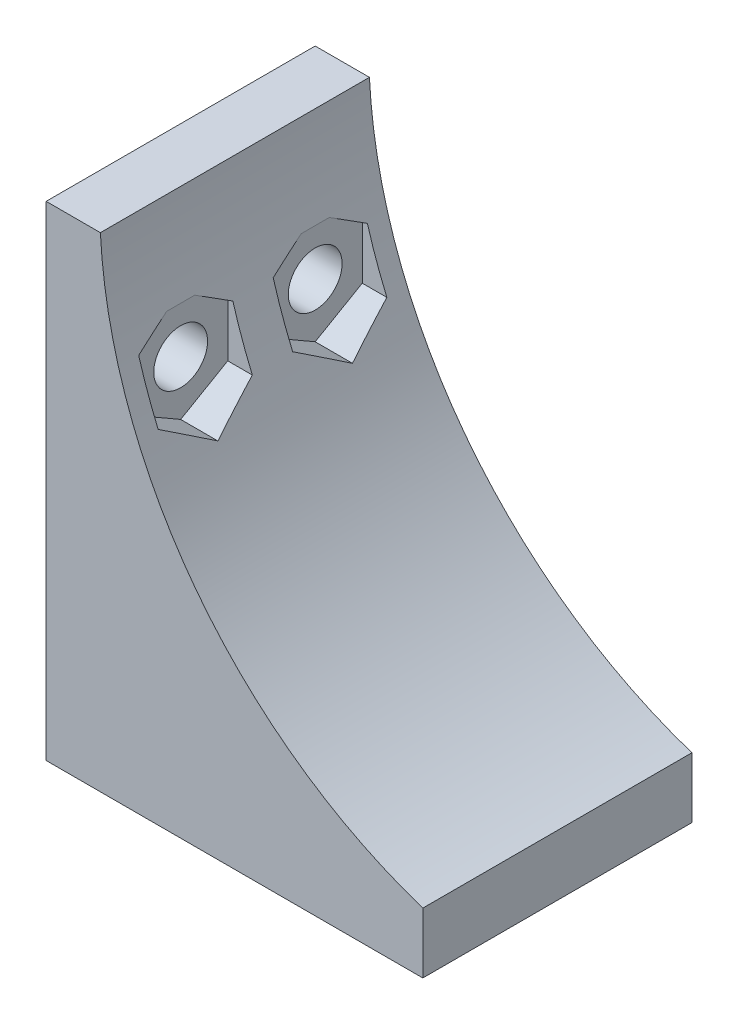
ISO-10303-21;
HEADER;
FILE_DESCRIPTION(('STEP AP214'),'2;1');
FILE_NAME('part.step','',(''),(''),'','','');
FILE_SCHEMA(('AUTOMOTIVE_DESIGN { 1 0 10303 214 1 1 1 1 }'));
ENDSEC;
DATA;
#1=APPLICATION_CONTEXT('core data for automotive mechanical design processes');
#2=APPLICATION_PROTOCOL_DEFINITION('international standard','automotive_design',2000,#1);
#3=PRODUCT_CONTEXT('',#1,'mechanical');
#4=PRODUCT('Part','Part','',(#3));
#5=PRODUCT_RELATED_PRODUCT_CATEGORY('part','',(#4));
#6=PRODUCT_DEFINITION_FORMATION('','',#4);
#7=PRODUCT_DEFINITION_CONTEXT('part definition',#1,'design');
#8=PRODUCT_DEFINITION('design','',#6,#7);
#9=PRODUCT_DEFINITION_SHAPE('','',#8);
#10=(LENGTH_UNIT() NAMED_UNIT(*) SI_UNIT(.MILLI.,.METRE.));
#11=(NAMED_UNIT(*) PLANE_ANGLE_UNIT() SI_UNIT($,.RADIAN.));
#12=(NAMED_UNIT(*) SI_UNIT($,.STERADIAN.) SOLID_ANGLE_UNIT());
#13=UNCERTAINTY_MEASURE_WITH_UNIT(LENGTH_MEASURE(1.E-05),#10,'distance_accuracy_value','');
#14=(GEOMETRIC_REPRESENTATION_CONTEXT(3) GLOBAL_UNCERTAINTY_ASSIGNED_CONTEXT((#13)) GLOBAL_UNIT_ASSIGNED_CONTEXT((#10,
#11,#12)) REPRESENTATION_CONTEXT('',''));
#15=CARTESIAN_POINT('',(0.,0.,0.));
#16=DIRECTION('',(0.,0.,1.));
#17=DIRECTION('',(1.,0.,0.));
#18=AXIS2_PLACEMENT_3D('',#15,#16,#17);
#19=CARTESIAN_POINT('',(39.1083800287427,37.8203087905264,10.));
#20=DIRECTION('',(0.,0.,-1.));
#21=DIRECTION('',(-1.,0.,0.));
#22=AXIS2_PLACEMENT_3D('',#19,#20,#21);
#23=CYLINDRICAL_SURFACE('',#22,35.1231986692414);
#24=CARTESIAN_POINT('',(39.1083800287427,37.8203087905264,-1.5));
#25=DIRECTION('',(0.,0.,-1.));
#26=DIRECTION('',(0.,1.,0.));
#27=AXIS2_PLACEMENT_3D('',#24,#25,#26);
#28=CIRCLE('',#27,35.1231986692414);
#29=CARTESIAN_POINT('',(5.37994601888869,28.0207259421637,-1.5));
#30=VERTEX_POINT('',#29);
#31=CARTESIAN_POINT('',(6.8273508895181,23.9792740578363,-1.5));
#32=VERTEX_POINT('',#31);
#33=EDGE_CURVE('E332',#30,#32,#28,.F.);
#34=ORIENTED_EDGE('',*,*,#33,.F.);
#35=CARTESIAN_POINT('',(39.1083800287427,37.8203087905264,-18.4733753863447));
#36=DIRECTION('',(0.,-0.866025403784438,-0.5));
#37=DIRECTION('',(0.,0.5,-0.866025403784438));
#38=AXIS2_PLACEMENT_3D('',#35,#36,#37);
#39=ELLIPSE('',#38,70.2463973384827,35.1231986692414);
#40=CARTESIAN_POINT('',(5.,29.4383342872326,-3.955369678893));
#41=VERTEX_POINT('',#40);
#42=EDGE_CURVE('E311',#41,#30,#39,.F.);
#43=ORIENTED_EDGE('',*,*,#42,.F.);
#44=DIRECTION('',(0.,0.,-1.));
#45=VECTOR('',#44,1.);
#46=CARTESIAN_POINT('',(5.,29.4383342872326,10.));
#47=LINE('',#46,#45);
#48=CARTESIAN_POINT('',(5.,29.4383342872326,-6.04463032110699));
#49=VERTEX_POINT('',#48);
#50=EDGE_CURVE('E248',#49,#41,#47,.F.);
#51=ORIENTED_EDGE('',*,*,#50,.F.);
#52=CARTESIAN_POINT('',(39.1083800287427,37.8203087905264,8.47337538634474));
#53=DIRECTION('',(0.,-0.866025403784438,0.5));
#54=DIRECTION('',(0.,-0.5,-0.866025403784438));
#55=AXIS2_PLACEMENT_3D('',#52,#53,#54);
#56=ELLIPSE('',#55,70.2463973384827,35.1231986692414);
#57=CARTESIAN_POINT('',(5.37994601888869,28.0207259421637,-8.49999999999999));
#58=VERTEX_POINT('',#57);
#59=EDGE_CURVE('E320',#58,#49,#56,.F.);
#60=ORIENTED_EDGE('',*,*,#59,.F.);
#61=CARTESIAN_POINT('',(39.1083800287427,37.8203087905264,-8.49999999999999));
#62=DIRECTION('',(0.,0.,1.));
#63=DIRECTION('',(0.,-1.,0.));
#64=AXIS2_PLACEMENT_3D('',#61,#62,#63);
#65=CIRCLE('',#64,35.1231986692414);
#66=CARTESIAN_POINT('',(6.82735088951809,23.9792740578363,-8.49999999999999));
#67=VERTEX_POINT('',#66);
#68=EDGE_CURVE('E323',#67,#58,#65,.F.);
#69=ORIENTED_EDGE('',*,*,#68,.F.);
#70=CARTESIAN_POINT('',(39.1083800287427,37.8203087905264,-32.4733753863447));
#71=DIRECTION('',(0.,0.866025403784438,0.500000000000001));
#72=DIRECTION('',(0.,0.500000000000001,-0.866025403784438));
#73=AXIS2_PLACEMENT_3D('',#70,#71,#72);
#74=ELLIPSE('',#73,70.2463973384827,35.1231986692414);
#75=CARTESIAN_POINT('',(7.77080461116032,21.9585481156726,-5.));
#76=VERTEX_POINT('',#75);
#77=EDGE_CURVE('E326',#76,#67,#74,.F.);
#78=ORIENTED_EDGE('',*,*,#77,.F.);
#79=CARTESIAN_POINT('',(39.1083800287427,37.8203087905264,22.4733753863448));
#80=DIRECTION('',(0.,0.866025403784439,-0.5));
#81=DIRECTION('',(0.,-0.5,-0.866025403784439));
#82=AXIS2_PLACEMENT_3D('',#79,#80,#81);
#83=ELLIPSE('',#82,70.2463973384828,35.1231986692414);
#84=EDGE_CURVE('E329',#32,#76,#83,.F.);
#85=ORIENTED_EDGE('',*,*,#84,.F.);
#86=EDGE_LOOP('',(#34,#43,#51,#60,#69,#78,#85));
#87=FACE_BOUND('',#86,.T.);
#88=CARTESIAN_POINT('',(39.1083800287427,37.8203087905264,-10.));
#89=DIRECTION('',(0.,0.,-1.));
#90=DIRECTION('',(1.,0.,0.));
#91=AXIS2_PLACEMENT_3D('',#88,#89,#90);
#92=CIRCLE('',#91,35.1231986692414);
#93=CARTESIAN_POINT('',(28.,4.5,-10.));
#94=VERTEX_POINT('',#93);
#95=CARTESIAN_POINT('',(4.03238309827565,36.,-10.));
#96=VERTEX_POINT('',#95);
#97=EDGE_CURVE('E265',#94,#96,#92,.T.);
#98=ORIENTED_EDGE('',*,*,#97,.T.);
#99=DIRECTION('',(0.,0.,-1.));
#100=VECTOR('',#99,1.);
#101=CARTESIAN_POINT('',(4.03238309827565,36.,10.));
#102=LINE('',#101,#100);
#103=CARTESIAN_POINT('',(4.03238309827565,36.,10.));
#104=VERTEX_POINT('',#103);
#105=EDGE_CURVE('E277',#104,#96,#102,.T.);
#106=ORIENTED_EDGE('',*,*,#105,.F.);
#107=CARTESIAN_POINT('',(39.1083800287427,37.8203087905264,10.));
#108=DIRECTION('',(0.,0.,-1.));
#109=DIRECTION('',(1.,0.,0.));
#110=AXIS2_PLACEMENT_3D('',#107,#108,#109);
#111=CIRCLE('',#110,35.1231986692414);
#112=CARTESIAN_POINT('',(28.,4.5,10.));
#113=VERTEX_POINT('',#112);
#114=EDGE_CURVE('E274',#113,#104,#111,.T.);
#115=ORIENTED_EDGE('',*,*,#114,.F.);
#116=DIRECTION('',(0.,0.,-1.));
#117=VECTOR('',#116,1.);
#118=CARTESIAN_POINT('',(28.,4.5,10.));
#119=LINE('',#118,#117);
#120=EDGE_CURVE('E295',#113,#94,#119,.T.);
#121=ORIENTED_EDGE('',*,*,#120,.T.);
#122=EDGE_LOOP('',(#98,#106,#115,#121));
#123=FACE_BOUND('',#122,.T.);
#124=CARTESIAN_POINT('',(39.1083800287427,37.8203087905264,8.5));
#125=DIRECTION('',(0.,0.,-1.));
#126=DIRECTION('',(-1.,0.,0.));
#127=AXIS2_PLACEMENT_3D('',#124,#125,#126);
#128=CIRCLE('',#127,35.1231986692414);
#129=CARTESIAN_POINT('',(5.37994601888869,28.0207259421637,8.5));
#130=VERTEX_POINT('',#129);
#131=CARTESIAN_POINT('',(6.8273508895181,23.9792740578363,8.5));
#132=VERTEX_POINT('',#131);
#133=EDGE_CURVE('E11',#130,#132,#128,.F.);
#134=ORIENTED_EDGE('',*,*,#133,.F.);
#135=CARTESIAN_POINT('',(39.1083800287427,37.8203087905264,-8.47337538634473));
#136=DIRECTION('',(0.,-0.866025403784438,-0.5));
#137=DIRECTION('',(0.,0.5,-0.866025403784438));
#138=AXIS2_PLACEMENT_3D('',#135,#136,#137);
#139=ELLIPSE('',#138,70.2463973384827,35.1231986692414);
#140=CARTESIAN_POINT('',(5.,29.4383342872326,6.044630321107));
#141=VERTEX_POINT('',#140);
#142=EDGE_CURVE('E165',#141,#130,#139,.F.);
#143=ORIENTED_EDGE('',*,*,#142,.F.);
#144=DIRECTION('',(0.,0.,-1.));
#145=VECTOR('',#144,1.);
#146=CARTESIAN_POINT('',(5.,29.4383342872326,10.));
#147=LINE('',#146,#145);
#148=CARTESIAN_POINT('',(5.,29.4383342872326,3.95536967889301));
#149=VERTEX_POINT('',#148);
#150=EDGE_CURVE('E179',#149,#141,#147,.F.);
#151=ORIENTED_EDGE('',*,*,#150,.F.);
#152=CARTESIAN_POINT('',(39.1083800287427,37.8203087905264,18.4733753863447));
#153=DIRECTION('',(0.,-0.866025403784438,0.5));
#154=DIRECTION('',(0.,-0.5,-0.866025403784438));
#155=AXIS2_PLACEMENT_3D('',#152,#153,#154);
#156=ELLIPSE('',#155,70.2463973384827,35.1231986692414);
#157=CARTESIAN_POINT('',(5.37994601888869,28.0207259421637,1.5));
#158=VERTEX_POINT('',#157);
#159=EDGE_CURVE('E337',#158,#149,#156,.F.);
#160=ORIENTED_EDGE('',*,*,#159,.F.);
#161=CARTESIAN_POINT('',(39.1083800287427,37.8203087905264,1.5));
#162=DIRECTION('',(0.,0.,1.));
#163=DIRECTION('',(1.,0.,0.));
#164=AXIS2_PLACEMENT_3D('',#161,#162,#163);
#165=CIRCLE('',#164,35.1231986692414);
#166=CARTESIAN_POINT('',(6.82735088951809,23.9792740578363,1.5));
#167=VERTEX_POINT('',#166);
#168=EDGE_CURVE('E340',#167,#158,#165,.F.);
#169=ORIENTED_EDGE('',*,*,#168,.F.);
#170=CARTESIAN_POINT('',(39.1083800287427,37.8203087905264,-22.4733753863448));
#171=DIRECTION('',(0.,0.866025403784439,0.5));
#172=DIRECTION('',(0.,0.5,-0.866025403784439));
#173=AXIS2_PLACEMENT_3D('',#170,#171,#172);
#174=ELLIPSE('',#173,70.2463973384829,35.1231986692414);
#175=CARTESIAN_POINT('',(7.77080461116032,21.9585481156726,5.));
#176=VERTEX_POINT('',#175);
#177=EDGE_CURVE('E343',#176,#167,#174,.F.);
#178=ORIENTED_EDGE('',*,*,#177,.F.);
#179=CARTESIAN_POINT('',(39.1083800287427,37.8203087905264,32.4733753863447));
#180=DIRECTION('',(0.,0.866025403784439,-0.5));
#181=DIRECTION('',(0.,-0.5,-0.866025403784439));
#182=AXIS2_PLACEMENT_3D('',#179,#180,#181);
#183=ELLIPSE('',#182,70.2463973384828,35.1231986692414);
#184=EDGE_CURVE('E48',#132,#176,#183,.F.);
#185=ORIENTED_EDGE('',*,*,#184,.F.);
#186=EDGE_LOOP('',(#134,#143,#151,#160,#169,#178,#185));
#187=FACE_BOUND('',#186,.T.);
#188=ADVANCED_FACE('F39',(#87,#123,#187),#23,.F.);
#189=CARTESIAN_POINT('',(-10.,26.,-5.));
#190=DIRECTION('',(1.,0.,0.));
#191=DIRECTION('',(0.,0.,-1.));
#192=AXIS2_PLACEMENT_3D('',#189,#190,#191);
#193=CYLINDRICAL_SURFACE('',#192,2.);
#194=CARTESIAN_POINT('',(0.,26.,-5.));
#195=DIRECTION('',(1.,0.,0.));
#196=DIRECTION('',(0.,1.,0.));
#197=AXIS2_PLACEMENT_3D('',#194,#195,#196);
#198=CIRCLE('',#197,2.);
#199=CARTESIAN_POINT('',(0.,28.,-5.));
#200=VERTEX_POINT('',#199);
#201=EDGE_CURVE('E251',#200,#200,#198,.T.);
#202=ORIENTED_EDGE('',*,*,#201,.F.);
#203=EDGE_LOOP('',(#202));
#204=FACE_BOUND('',#203,.T.);
#205=CARTESIAN_POINT('',(5.,26.,-5.));
#206=DIRECTION('',(1.,0.,0.));
#207=DIRECTION('',(0.,0.,-1.));
#208=AXIS2_PLACEMENT_3D('',#205,#206,#207);
#209=CIRCLE('',#208,2.);
#210=CARTESIAN_POINT('',(5.,26.,-7.));
#211=VERTEX_POINT('',#210);
#212=EDGE_CURVE('E247',#211,#211,#209,.F.);
#213=ORIENTED_EDGE('',*,*,#212,.F.);
#214=EDGE_LOOP('',(#213));
#215=FACE_BOUND('',#214,.T.);
#216=ADVANCED_FACE('F378',(#204,#215),#193,.F.);
#217=CARTESIAN_POINT('',(-10.,26.,5.));
#218=DIRECTION('',(1.,0.,0.));
#219=DIRECTION('',(0.,0.,-1.));
#220=AXIS2_PLACEMENT_3D('',#217,#218,#219);
#221=CYLINDRICAL_SURFACE('',#220,2.);
#222=CARTESIAN_POINT('',(0.,26.,5.));
#223=DIRECTION('',(1.,0.,0.));
#224=DIRECTION('',(0.,1.,0.));
#225=AXIS2_PLACEMENT_3D('',#222,#223,#224);
#226=CIRCLE('',#225,2.);
#227=CARTESIAN_POINT('',(0.,28.,5.));
#228=VERTEX_POINT('',#227);
#229=EDGE_CURVE('E255',#228,#228,#226,.T.);
#230=ORIENTED_EDGE('',*,*,#229,.F.);
#231=EDGE_LOOP('',(#230));
#232=FACE_BOUND('',#231,.T.);
#233=CARTESIAN_POINT('',(5.,26.,5.));
#234=DIRECTION('',(1.,0.,0.));
#235=DIRECTION('',(0.,0.,-1.));
#236=AXIS2_PLACEMENT_3D('',#233,#234,#235);
#237=CIRCLE('',#236,2.);
#238=CARTESIAN_POINT('',(5.,26.,3.));
#239=VERTEX_POINT('',#238);
#240=EDGE_CURVE('E170',#239,#239,#237,.F.);
#241=ORIENTED_EDGE('',*,*,#240,.F.);
#242=EDGE_LOOP('',(#241));
#243=FACE_BOUND('',#242,.T.);
#244=ADVANCED_FACE('F384',(#232,#243),#221,.F.);
#245=CARTESIAN_POINT('',(0.,36.,10.));
#246=DIRECTION('',(0.,-1.,0.));
#247=DIRECTION('',(1.,0.,0.));
#248=AXIS2_PLACEMENT_3D('',#245,#246,#247);
#249=PLANE('',#248);
#250=DIRECTION('',(-1.,0.,0.));
#251=VECTOR('',#250,1.);
#252=CARTESIAN_POINT('',(0.,36.,-10.));
#253=LINE('',#252,#251);
#254=CARTESIAN_POINT('',(0.,36.,-10.));
#255=VERTEX_POINT('',#254);
#256=EDGE_CURVE('E259',#96,#255,#253,.T.);
#257=ORIENTED_EDGE('',*,*,#256,.T.);
#258=DIRECTION('',(0.,0.,-1.));
#259=VECTOR('',#258,1.);
#260=CARTESIAN_POINT('',(0.,36.,10.));
#261=LINE('',#260,#259);
#262=CARTESIAN_POINT('',(0.,36.,10.));
#263=VERTEX_POINT('',#262);
#264=EDGE_CURVE('E307',#263,#255,#261,.T.);
#265=ORIENTED_EDGE('',*,*,#264,.F.);
#266=DIRECTION('',(-1.,0.,0.));
#267=VECTOR('',#266,1.);
#268=CARTESIAN_POINT('',(0.,36.,10.));
#269=LINE('',#268,#267);
#270=EDGE_CURVE('E260',#104,#263,#269,.T.);
#271=ORIENTED_EDGE('',*,*,#270,.F.);
#272=ORIENTED_EDGE('',*,*,#105,.T.);
#273=EDGE_LOOP('',(#257,#265,#271,#272));
#274=FACE_BOUND('',#273,.T.);
#275=ADVANCED_FACE('F41',(#274),#249,.F.);
#276=CARTESIAN_POINT('',(0.,36.,10.));
#277=DIRECTION('',(1.,0.,0.));
#278=DIRECTION('',(0.,1.,0.));
#279=AXIS2_PLACEMENT_3D('',#276,#277,#278);
#280=PLANE('',#279);
#281=ORIENTED_EDGE('',*,*,#229,.T.);
#282=EDGE_LOOP('',(#281));
#283=FACE_BOUND('',#282,.T.);
#284=ORIENTED_EDGE('',*,*,#201,.T.);
#285=EDGE_LOOP('',(#284));
#286=FACE_BOUND('',#285,.T.);
#287=DIRECTION('',(0.,-1.,0.));
#288=VECTOR('',#287,1.);
#289=CARTESIAN_POINT('',(0.,36.,-10.));
#290=LINE('',#289,#288);
#291=CARTESIAN_POINT('',(0.,0.,-10.));
#292=VERTEX_POINT('',#291);
#293=EDGE_CURVE('E281',#255,#292,#290,.T.);
#294=ORIENTED_EDGE('',*,*,#293,.T.);
#295=DIRECTION('',(0.,0.,-1.));
#296=VECTOR('',#295,1.);
#297=CARTESIAN_POINT('',(0.,0.,10.));
#298=LINE('',#297,#296);
#299=CARTESIAN_POINT('',(0.,0.,10.));
#300=VERTEX_POINT('',#299);
#301=EDGE_CURVE('E303',#300,#292,#298,.T.);
#302=ORIENTED_EDGE('',*,*,#301,.F.);
#303=DIRECTION('',(0.,-1.,0.));
#304=VECTOR('',#303,1.);
#305=CARTESIAN_POINT('',(0.,36.,10.));
#306=LINE('',#305,#304);
#307=EDGE_CURVE('E264',#263,#300,#306,.T.);
#308=ORIENTED_EDGE('',*,*,#307,.F.);
#309=ORIENTED_EDGE('',*,*,#264,.T.);
#310=EDGE_LOOP('',(#294,#302,#308,#309));
#311=FACE_BOUND('',#310,.T.);
#312=ADVANCED_FACE('F397',(#283,#286,#311),#280,.F.);
#313=CARTESIAN_POINT('',(0.,0.,10.));
#314=DIRECTION('',(0.,1.,0.));
#315=DIRECTION('',(0.,0.,1.));
#316=AXIS2_PLACEMENT_3D('',#313,#314,#315);
#317=PLANE('',#316);
#318=DIRECTION('',(1.,0.,0.));
#319=VECTOR('',#318,1.);
#320=CARTESIAN_POINT('',(0.,0.,-10.));
#321=LINE('',#320,#319);
#322=CARTESIAN_POINT('',(28.,0.,-10.));
#323=VERTEX_POINT('',#322);
#324=EDGE_CURVE('E284',#292,#323,#321,.T.);
#325=ORIENTED_EDGE('',*,*,#324,.T.);
#326=DIRECTION('',(0.,0.,-1.));
#327=VECTOR('',#326,1.);
#328=CARTESIAN_POINT('',(28.,0.,10.));
#329=LINE('',#328,#327);
#330=CARTESIAN_POINT('',(28.,0.,10.));
#331=VERTEX_POINT('',#330);
#332=EDGE_CURVE('E299',#331,#323,#329,.T.);
#333=ORIENTED_EDGE('',*,*,#332,.F.);
#334=DIRECTION('',(1.,0.,0.));
#335=VECTOR('',#334,1.);
#336=CARTESIAN_POINT('',(0.,0.,10.));
#337=LINE('',#336,#335);
#338=EDGE_CURVE('E268',#300,#331,#337,.T.);
#339=ORIENTED_EDGE('',*,*,#338,.F.);
#340=ORIENTED_EDGE('',*,*,#301,.T.);
#341=EDGE_LOOP('',(#325,#333,#339,#340));
#342=FACE_BOUND('',#341,.T.);
#343=ADVANCED_FACE('F394',(#342),#317,.F.);
#344=CARTESIAN_POINT('',(28.,0.,10.));
#345=DIRECTION('',(-1.,0.,0.));
#346=DIRECTION('',(0.,0.,1.));
#347=AXIS2_PLACEMENT_3D('',#344,#345,#346);
#348=PLANE('',#347);
#349=DIRECTION('',(0.,1.,0.));
#350=VECTOR('',#349,1.);
#351=CARTESIAN_POINT('',(28.,0.,-10.));
#352=LINE('',#351,#350);
#353=EDGE_CURVE('E287',#323,#94,#352,.T.);
#354=ORIENTED_EDGE('',*,*,#353,.T.);
#355=ORIENTED_EDGE('',*,*,#120,.F.);
#356=DIRECTION('',(0.,1.,0.));
#357=VECTOR('',#356,1.);
#358=CARTESIAN_POINT('',(28.,0.,10.));
#359=LINE('',#358,#357);
#360=EDGE_CURVE('E271',#331,#113,#359,.T.);
#361=ORIENTED_EDGE('',*,*,#360,.F.);
#362=ORIENTED_EDGE('',*,*,#332,.T.);
#363=EDGE_LOOP('',(#354,#355,#361,#362));
#364=FACE_BOUND('',#363,.T.);
#365=ADVANCED_FACE('F391',(#364),#348,.F.);
#366=CARTESIAN_POINT('',(39.1083800287427,37.8203087905264,10.));
#367=DIRECTION('',(0.,0.,1.));
#368=DIRECTION('',(1.,0.,0.));
#369=AXIS2_PLACEMENT_3D('',#366,#367,#368);
#370=PLANE('',#369);
#371=ORIENTED_EDGE('',*,*,#270,.T.);
#372=ORIENTED_EDGE('',*,*,#307,.T.);
#373=ORIENTED_EDGE('',*,*,#338,.T.);
#374=ORIENTED_EDGE('',*,*,#360,.T.);
#375=ORIENTED_EDGE('',*,*,#114,.T.);
#376=EDGE_LOOP('',(#371,#372,#373,#374,#375));
#377=FACE_BOUND('',#376,.T.);
#378=ADVANCED_FACE('F373',(#377),#370,.T.);
#379=CARTESIAN_POINT('',(39.1083800287427,37.8203087905264,-10.));
#380=DIRECTION('',(0.,0.,1.));
#381=DIRECTION('',(1.,0.,0.));
#382=AXIS2_PLACEMENT_3D('',#379,#380,#381);
#383=PLANE('',#382);
#384=ORIENTED_EDGE('',*,*,#256,.F.);
#385=ORIENTED_EDGE('',*,*,#97,.F.);
#386=ORIENTED_EDGE('',*,*,#353,.F.);
#387=ORIENTED_EDGE('',*,*,#324,.F.);
#388=ORIENTED_EDGE('',*,*,#293,.F.);
#389=EDGE_LOOP('',(#384,#385,#386,#387,#388));
#390=FACE_BOUND('',#389,.T.);
#391=ADVANCED_FACE('F366',(#390),#383,.F.);
#392=CARTESIAN_POINT('',(25.,28.0207259421637,1.5));
#393=DIRECTION('',(0.,-0.866025403784438,0.5));
#394=DIRECTION('',(0.,-0.5,-0.866025403784438));
#395=AXIS2_PLACEMENT_3D('',#392,#393,#394);
#396=PLANE('',#395);
#397=ORIENTED_EDGE('',*,*,#159,.T.);
#398=DIRECTION('',(0.,0.5,0.866025403784438));
#399=VECTOR('',#398,1.);
#400=CARTESIAN_POINT('',(5.,28.0207259421637,1.5));
#401=LINE('',#400,#399);
#402=CARTESIAN_POINT('',(5.,28.0207259421637,1.5));
#403=VERTEX_POINT('',#402);
#404=EDGE_CURVE('E55',#403,#149,#401,.T.);
#405=ORIENTED_EDGE('',*,*,#404,.F.);
#406=DIRECTION('',(-1.,0.,0.));
#407=VECTOR('',#406,1.);
#408=CARTESIAN_POINT('',(25.,28.0207259421637,1.5));
#409=LINE('',#408,#407);
#410=EDGE_CURVE('E198',#158,#403,#409,.T.);
#411=ORIENTED_EDGE('',*,*,#410,.F.);
#412=EDGE_LOOP('',(#397,#405,#411));
#413=FACE_BOUND('',#412,.T.);
#414=ADVANCED_FACE('F363',(#413),#396,.T.);
#415=CARTESIAN_POINT('',(25.,30.0414518843274,5.));
#416=DIRECTION('',(0.,-0.866025403784438,-0.5));
#417=DIRECTION('',(0.,0.5,-0.866025403784438));
#418=AXIS2_PLACEMENT_3D('',#415,#416,#417);
#419=PLANE('',#418);
#420=ORIENTED_EDGE('',*,*,#142,.T.);
#421=DIRECTION('',(-1.,0.,0.));
#422=VECTOR('',#421,1.);
#423=CARTESIAN_POINT('',(25.,28.0207259421637,8.5));
#424=LINE('',#423,#422);
#425=CARTESIAN_POINT('',(5.,28.0207259421637,8.5));
#426=VERTEX_POINT('',#425);
#427=EDGE_CURVE('E160',#130,#426,#424,.T.);
#428=ORIENTED_EDGE('',*,*,#427,.T.);
#429=DIRECTION('',(0.,-0.5,0.866025403784438));
#430=VECTOR('',#429,1.);
#431=CARTESIAN_POINT('',(5.,30.0414518843274,5.));
#432=LINE('',#431,#430);
#433=EDGE_CURVE('E163',#141,#426,#432,.T.);
#434=ORIENTED_EDGE('',*,*,#433,.F.);
#435=EDGE_LOOP('',(#420,#428,#434));
#436=FACE_BOUND('',#435,.T.);
#437=ADVANCED_FACE('F162',(#436),#419,.T.);
#438=CARTESIAN_POINT('',(25.,28.0207259421637,8.5));
#439=DIRECTION('',(0.,0.,-1.));
#440=DIRECTION('',(-1.,0.,0.));
#441=AXIS2_PLACEMENT_3D('',#438,#439,#440);
#442=PLANE('',#441);
#443=ORIENTED_EDGE('',*,*,#133,.T.);
#444=DIRECTION('',(-1.,0.,0.));
#445=VECTOR('',#444,1.);
#446=CARTESIAN_POINT('',(25.,23.9792740578363,8.5));
#447=LINE('',#446,#445);
#448=CARTESIAN_POINT('',(5.,23.9792740578363,8.5));
#449=VERTEX_POINT('',#448);
#450=EDGE_CURVE('E171',#132,#449,#447,.T.);
#451=ORIENTED_EDGE('',*,*,#450,.T.);
#452=DIRECTION('',(0.,-1.,0.));
#453=VECTOR('',#452,1.);
#454=CARTESIAN_POINT('',(5.,28.0207259421637,8.5));
#455=LINE('',#454,#453);
#456=EDGE_CURVE('E176',#426,#449,#455,.T.);
#457=ORIENTED_EDGE('',*,*,#456,.F.);
#458=ORIENTED_EDGE('',*,*,#427,.F.);
#459=EDGE_LOOP('',(#443,#451,#457,#458));
#460=FACE_BOUND('',#459,.T.);
#461=ADVANCED_FACE('F182',(#460),#442,.T.);
#462=CARTESIAN_POINT('',(25.,23.9792740578363,8.5));
#463=DIRECTION('',(0.,0.866025403784439,-0.5));
#464=DIRECTION('',(0.,0.5,0.866025403784439));
#465=AXIS2_PLACEMENT_3D('',#462,#463,#464);
#466=PLANE('',#465);
#467=ORIENTED_EDGE('',*,*,#184,.T.);
#468=DIRECTION('',(-1.,0.,0.));
#469=VECTOR('',#468,1.);
#470=CARTESIAN_POINT('',(25.,21.9585481156726,5.));
#471=LINE('',#470,#469);
#472=CARTESIAN_POINT('',(5.,21.9585481156726,5.));
#473=VERTEX_POINT('',#472);
#474=EDGE_CURVE('E204',#176,#473,#471,.T.);
#475=ORIENTED_EDGE('',*,*,#474,.T.);
#476=DIRECTION('',(0.,-0.5,-0.866025403784439));
#477=VECTOR('',#476,1.);
#478=CARTESIAN_POINT('',(5.,23.9792740578363,8.5));
#479=LINE('',#478,#477);
#480=EDGE_CURVE('E185',#449,#473,#479,.T.);
#481=ORIENTED_EDGE('',*,*,#480,.F.);
#482=ORIENTED_EDGE('',*,*,#450,.F.);
#483=EDGE_LOOP('',(#467,#475,#481,#482));
#484=FACE_BOUND('',#483,.T.);
#485=ADVANCED_FACE('F349',(#484),#466,.T.);
#486=CARTESIAN_POINT('',(25.,21.9585481156726,5.));
#487=DIRECTION('',(0.,0.866025403784439,0.5));
#488=DIRECTION('',(0.,-0.5,0.866025403784439));
#489=AXIS2_PLACEMENT_3D('',#486,#487,#488);
#490=PLANE('',#489);
#491=ORIENTED_EDGE('',*,*,#177,.T.);
#492=DIRECTION('',(-1.,0.,0.));
#493=VECTOR('',#492,1.);
#494=CARTESIAN_POINT('',(25.,23.9792740578363,1.5));
#495=LINE('',#494,#493);
#496=CARTESIAN_POINT('',(5.,23.9792740578363,1.5));
#497=VERTEX_POINT('',#496);
#498=EDGE_CURVE('E201',#167,#497,#495,.T.);
#499=ORIENTED_EDGE('',*,*,#498,.T.);
#500=DIRECTION('',(0.,0.5,-0.866025403784439));
#501=VECTOR('',#500,1.);
#502=CARTESIAN_POINT('',(5.,21.9585481156726,5.));
#503=LINE('',#502,#501);
#504=EDGE_CURVE('E188',#473,#497,#503,.T.);
#505=ORIENTED_EDGE('',*,*,#504,.F.);
#506=ORIENTED_EDGE('',*,*,#474,.F.);
#507=EDGE_LOOP('',(#491,#499,#505,#506));
#508=FACE_BOUND('',#507,.T.);
#509=ADVANCED_FACE('F354',(#508),#490,.T.);
#510=CARTESIAN_POINT('',(25.,23.9792740578363,1.5));
#511=DIRECTION('',(0.,0.,1.));
#512=DIRECTION('',(1.,0.,0.));
#513=AXIS2_PLACEMENT_3D('',#510,#511,#512);
#514=PLANE('',#513);
#515=ORIENTED_EDGE('',*,*,#168,.T.);
#516=ORIENTED_EDGE('',*,*,#410,.T.);
#517=DIRECTION('',(0.,1.,0.));
#518=VECTOR('',#517,1.);
#519=CARTESIAN_POINT('',(5.,23.9792740578363,1.5));
#520=LINE('',#519,#518);
#521=EDGE_CURVE('E195',#497,#403,#520,.T.);
#522=ORIENTED_EDGE('',*,*,#521,.F.);
#523=ORIENTED_EDGE('',*,*,#498,.F.);
#524=EDGE_LOOP('',(#515,#516,#522,#523));
#525=FACE_BOUND('',#524,.T.);
#526=ADVANCED_FACE('F360',(#525),#514,.T.);
#527=CARTESIAN_POINT('',(5.,0.,0.));
#528=DIRECTION('',(1.,0.,0.));
#529=DIRECTION('',(0.,0.,-1.));
#530=AXIS2_PLACEMENT_3D('',#527,#528,#529);
#531=PLANE('',#530);
#532=ORIENTED_EDGE('',*,*,#240,.T.);
#533=EDGE_LOOP('',(#532));
#534=FACE_BOUND('',#533,.T.);
#535=ORIENTED_EDGE('',*,*,#150,.T.);
#536=ORIENTED_EDGE('',*,*,#433,.T.);
#537=ORIENTED_EDGE('',*,*,#456,.T.);
#538=ORIENTED_EDGE('',*,*,#480,.T.);
#539=ORIENTED_EDGE('',*,*,#504,.T.);
#540=ORIENTED_EDGE('',*,*,#521,.T.);
#541=ORIENTED_EDGE('',*,*,#404,.T.);
#542=EDGE_LOOP('',(#535,#536,#537,#538,#539,#540,#541));
#543=FACE_BOUND('',#542,.T.);
#544=ADVANCED_FACE('F174',(#534,#543),#531,.T.);
#545=CARTESIAN_POINT('',(25.,28.0207259421637,-8.49999999999999));
#546=DIRECTION('',(0.,-0.866025403784438,0.5));
#547=DIRECTION('',(0.,-0.5,-0.866025403784438));
#548=AXIS2_PLACEMENT_3D('',#545,#546,#547);
#549=PLANE('',#548);
#550=ORIENTED_EDGE('',*,*,#59,.T.);
#551=DIRECTION('',(0.,0.5,0.866025403784438));
#552=VECTOR('',#551,1.);
#553=CARTESIAN_POINT('',(5.,28.0207259421637,-8.49999999999999));
#554=LINE('',#553,#552);
#555=CARTESIAN_POINT('',(5.,28.0207259421637,-8.49999999999999));
#556=VERTEX_POINT('',#555);
#557=EDGE_CURVE('E63',#556,#49,#554,.T.);
#558=ORIENTED_EDGE('',*,*,#557,.F.);
#559=DIRECTION('',(-1.,0.,0.));
#560=VECTOR('',#559,1.);
#561=CARTESIAN_POINT('',(25.,28.0207259421637,-8.49999999999999));
#562=LINE('',#561,#560);
#563=EDGE_CURVE('E230',#58,#556,#562,.T.);
#564=ORIENTED_EDGE('',*,*,#563,.F.);
#565=EDGE_LOOP('',(#550,#558,#564));
#566=FACE_BOUND('',#565,.T.);
#567=ADVANCED_FACE('F430',(#566),#549,.T.);
#568=CARTESIAN_POINT('',(25.,30.0414518843274,-4.99999999999999));
#569=DIRECTION('',(0.,-0.866025403784438,-0.5));
#570=DIRECTION('',(0.,0.5,-0.866025403784438));
#571=AXIS2_PLACEMENT_3D('',#568,#569,#570);
#572=PLANE('',#571);
#573=ORIENTED_EDGE('',*,*,#42,.T.);
#574=DIRECTION('',(-1.,0.,0.));
#575=VECTOR('',#574,1.);
#576=CARTESIAN_POINT('',(25.,28.0207259421637,-1.5));
#577=LINE('',#576,#575);
#578=CARTESIAN_POINT('',(5.,28.0207259421637,-1.5));
#579=VERTEX_POINT('',#578);
#580=EDGE_CURVE('E242',#30,#579,#577,.T.);
#581=ORIENTED_EDGE('',*,*,#580,.T.);
#582=DIRECTION('',(0.,-0.5,0.866025403784438));
#583=VECTOR('',#582,1.);
#584=CARTESIAN_POINT('',(5.,30.0414518843274,-4.99999999999999));
#585=LINE('',#584,#583);
#586=EDGE_CURVE('E211',#41,#579,#585,.T.);
#587=ORIENTED_EDGE('',*,*,#586,.F.);
#588=EDGE_LOOP('',(#573,#581,#587));
#589=FACE_BOUND('',#588,.T.);
#590=ADVANCED_FACE('F433',(#589),#572,.T.);
#591=CARTESIAN_POINT('',(25.,28.0207259421637,-1.5));
#592=DIRECTION('',(0.,0.,-1.));
#593=DIRECTION('',(0.,1.,0.));
#594=AXIS2_PLACEMENT_3D('',#591,#592,#593);
#595=PLANE('',#594);
#596=ORIENTED_EDGE('',*,*,#33,.T.);
#597=DIRECTION('',(-1.,0.,0.));
#598=VECTOR('',#597,1.);
#599=CARTESIAN_POINT('',(25.,23.9792740578363,-1.5));
#600=LINE('',#599,#598);
#601=CARTESIAN_POINT('',(5.,23.9792740578363,-1.5));
#602=VERTEX_POINT('',#601);
#603=EDGE_CURVE('E239',#32,#602,#600,.T.);
#604=ORIENTED_EDGE('',*,*,#603,.T.);
#605=DIRECTION('',(0.,-1.,0.));
#606=VECTOR('',#605,1.);
#607=CARTESIAN_POINT('',(5.,28.0207259421637,-1.5));
#608=LINE('',#607,#606);
#609=EDGE_CURVE('E215',#579,#602,#608,.T.);
#610=ORIENTED_EDGE('',*,*,#609,.F.);
#611=ORIENTED_EDGE('',*,*,#580,.F.);
#612=EDGE_LOOP('',(#596,#604,#610,#611));
#613=FACE_BOUND('',#612,.T.);
#614=ADVANCED_FACE('F437',(#613),#595,.T.);
#615=CARTESIAN_POINT('',(25.,23.9792740578363,-1.5));
#616=DIRECTION('',(0.,0.866025403784439,-0.5));
#617=DIRECTION('',(0.,0.5,0.866025403784439));
#618=AXIS2_PLACEMENT_3D('',#615,#616,#617);
#619=PLANE('',#618);
#620=ORIENTED_EDGE('',*,*,#84,.T.);
#621=DIRECTION('',(-1.,0.,0.));
#622=VECTOR('',#621,1.);
#623=CARTESIAN_POINT('',(25.,21.9585481156726,-5.));
#624=LINE('',#623,#622);
#625=CARTESIAN_POINT('',(5.,21.9585481156726,-5.));
#626=VERTEX_POINT('',#625);
#627=EDGE_CURVE('E236',#76,#626,#624,.T.);
#628=ORIENTED_EDGE('',*,*,#627,.T.);
#629=DIRECTION('',(0.,-0.5,-0.866025403784439));
#630=VECTOR('',#629,1.);
#631=CARTESIAN_POINT('',(5.,23.9792740578363,-1.5));
#632=LINE('',#631,#630);
#633=EDGE_CURVE('E219',#602,#626,#632,.T.);
#634=ORIENTED_EDGE('',*,*,#633,.F.);
#635=ORIENTED_EDGE('',*,*,#603,.F.);
#636=EDGE_LOOP('',(#620,#628,#634,#635));
#637=FACE_BOUND('',#636,.T.);
#638=ADVANCED_FACE('F441',(#637),#619,.T.);
#639=CARTESIAN_POINT('',(25.,21.9585481156726,-5.));
#640=DIRECTION('',(0.,0.866025403784438,0.500000000000001));
#641=DIRECTION('',(0.,-0.500000000000001,0.866025403784438));
#642=AXIS2_PLACEMENT_3D('',#639,#640,#641);
#643=PLANE('',#642);
#644=ORIENTED_EDGE('',*,*,#77,.T.);
#645=DIRECTION('',(-1.,0.,0.));
#646=VECTOR('',#645,1.);
#647=CARTESIAN_POINT('',(25.,23.9792740578363,-8.49999999999999));
#648=LINE('',#647,#646);
#649=CARTESIAN_POINT('',(5.,23.9792740578363,-8.49999999999999));
#650=VERTEX_POINT('',#649);
#651=EDGE_CURVE('E233',#67,#650,#648,.T.);
#652=ORIENTED_EDGE('',*,*,#651,.T.);
#653=DIRECTION('',(0.,0.500000000000001,-0.866025403784438));
#654=VECTOR('',#653,1.);
#655=CARTESIAN_POINT('',(5.,21.9585481156726,-5.));
#656=LINE('',#655,#654);
#657=EDGE_CURVE('E223',#626,#650,#656,.T.);
#658=ORIENTED_EDGE('',*,*,#657,.F.);
#659=ORIENTED_EDGE('',*,*,#627,.F.);
#660=EDGE_LOOP('',(#644,#652,#658,#659));
#661=FACE_BOUND('',#660,.T.);
#662=ADVANCED_FACE('F445',(#661),#643,.T.);
#663=CARTESIAN_POINT('',(25.,23.9792740578363,-8.49999999999999));
#664=DIRECTION('',(0.,0.,1.));
#665=DIRECTION('',(0.,-1.,0.));
#666=AXIS2_PLACEMENT_3D('',#663,#664,#665);
#667=PLANE('',#666);
#668=ORIENTED_EDGE('',*,*,#68,.T.);
#669=ORIENTED_EDGE('',*,*,#563,.T.);
#670=DIRECTION('',(0.,1.,0.));
#671=VECTOR('',#670,1.);
#672=CARTESIAN_POINT('',(5.,23.9792740578363,-8.49999999999999));
#673=LINE('',#672,#671);
#674=EDGE_CURVE('E227',#650,#556,#673,.T.);
#675=ORIENTED_EDGE('',*,*,#674,.F.);
#676=ORIENTED_EDGE('',*,*,#651,.F.);
#677=EDGE_LOOP('',(#668,#669,#675,#676));
#678=FACE_BOUND('',#677,.T.);
#679=ADVANCED_FACE('F449',(#678),#667,.T.);
#680=CARTESIAN_POINT('',(5.,0.,0.));
#681=DIRECTION('',(1.,0.,0.));
#682=DIRECTION('',(0.,0.,-1.));
#683=AXIS2_PLACEMENT_3D('',#680,#681,#682);
#684=PLANE('',#683);
#685=ORIENTED_EDGE('',*,*,#212,.T.);
#686=EDGE_LOOP('',(#685));
#687=FACE_BOUND('',#686,.T.);
#688=ORIENTED_EDGE('',*,*,#50,.T.);
#689=ORIENTED_EDGE('',*,*,#586,.T.);
#690=ORIENTED_EDGE('',*,*,#609,.T.);
#691=ORIENTED_EDGE('',*,*,#633,.T.);
#692=ORIENTED_EDGE('',*,*,#657,.T.);
#693=ORIENTED_EDGE('',*,*,#674,.T.);
#694=ORIENTED_EDGE('',*,*,#557,.T.);
#695=EDGE_LOOP('',(#688,#689,#690,#691,#692,#693,#694));
#696=FACE_BOUND('',#695,.T.);
#697=ADVANCED_FACE('F452',(#687,#696),#684,.T.);
#698=CLOSED_SHELL('',(#188,#216,#244,#275,#312,#343,#365,#378,#391,#414,#437,#461,#485,#509,
#526,#544,#567,#590,#614,#638,#662,#679,#697));
#699=MANIFOLD_SOLID_BREP('B2',#698);
#700=ADVANCED_BREP_SHAPE_REPRESENTATION('',(#18,#699),#14);
#701=SHAPE_DEFINITION_REPRESENTATION(#9,#700);
ENDSEC;
END-ISO-10303-21;
